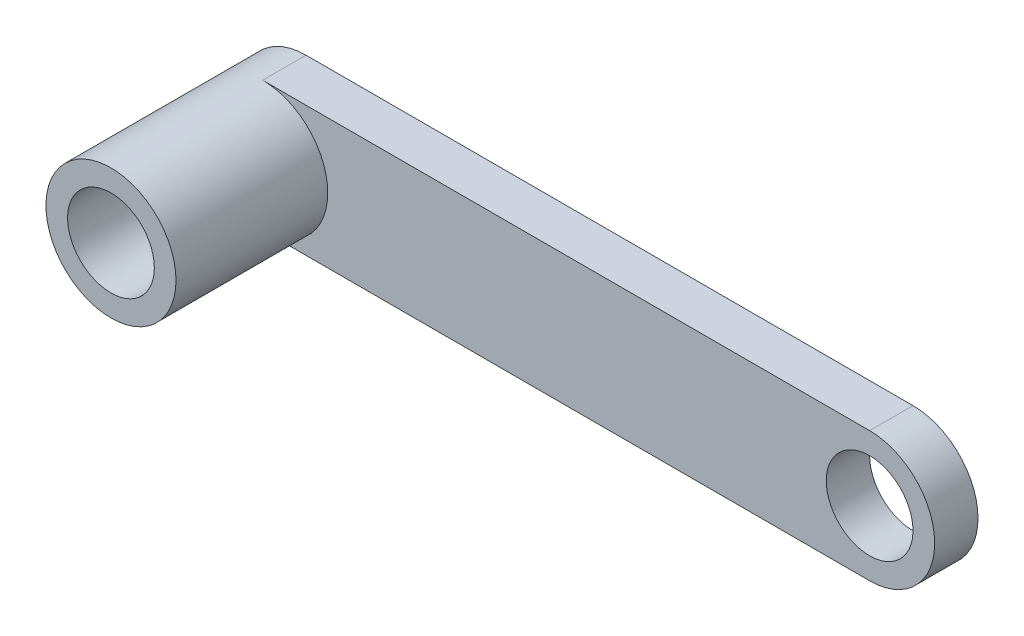
ISO-10303-21;
HEADER;
FILE_DESCRIPTION(('STEP AP214'),'2;1');
FILE_NAME('part.step','',(''),(''),'','','');
FILE_SCHEMA(('AUTOMOTIVE_DESIGN { 1 0 10303 214 1 1 1 1 }'));
ENDSEC;
DATA;
#1=APPLICATION_CONTEXT('core data for automotive mechanical design processes');
#2=APPLICATION_PROTOCOL_DEFINITION('international standard','automotive_design',2000,#1);
#3=PRODUCT_CONTEXT('',#1,'mechanical');
#4=PRODUCT('Part','Part','',(#3));
#5=PRODUCT_RELATED_PRODUCT_CATEGORY('part','',(#4));
#6=PRODUCT_DEFINITION_FORMATION('','',#4);
#7=PRODUCT_DEFINITION_CONTEXT('part definition',#1,'design');
#8=PRODUCT_DEFINITION('design','',#6,#7);
#9=PRODUCT_DEFINITION_SHAPE('','',#8);
#10=(LENGTH_UNIT() NAMED_UNIT(*) SI_UNIT(.MILLI.,.METRE.));
#11=(NAMED_UNIT(*) PLANE_ANGLE_UNIT() SI_UNIT($,.RADIAN.));
#12=(NAMED_UNIT(*) SI_UNIT($,.STERADIAN.) SOLID_ANGLE_UNIT());
#13=UNCERTAINTY_MEASURE_WITH_UNIT(LENGTH_MEASURE(1.E-05),#10,'distance_accuracy_value','');
#14=(GEOMETRIC_REPRESENTATION_CONTEXT(3) GLOBAL_UNCERTAINTY_ASSIGNED_CONTEXT((#13)) GLOBAL_UNIT_ASSIGNED_CONTEXT((#10,
#11,#12)) REPRESENTATION_CONTEXT('',''));
#15=CARTESIAN_POINT('',(0.,0.,0.));
#16=DIRECTION('',(0.,0.,1.));
#17=DIRECTION('',(1.,0.,0.));
#18=AXIS2_PLACEMENT_3D('',#15,#16,#17);
#19=CARTESIAN_POINT('',(-49.2925132380591,7.49999999999997,10.));
#20=DIRECTION('',(0.,0.,1.));
#21=DIRECTION('',(1.,0.,0.));
#22=AXIS2_PLACEMENT_3D('',#19,#20,#21);
#23=PLANE('',#22);
#24=CARTESIAN_POINT('',(-49.2925132380591,7.49999999999997,10.));
#25=DIRECTION('',(0.,0.,1.));
#26=DIRECTION('',(1.,0.,0.));
#27=AXIS2_PLACEMENT_3D('',#24,#25,#26);
#28=CIRCLE('',#27,15.);
#29=CARTESIAN_POINT('',(-49.2925132380591,-7.50000000000003,10.));
#30=VERTEX_POINT('',#29);
#31=CARTESIAN_POINT('',(-49.2925132380591,22.5,10.));
#32=VERTEX_POINT('',#31);
#33=EDGE_CURVE('E11',#30,#32,#28,.T.);
#34=ORIENTED_EDGE('',*,*,#33,.F.);
#35=DIRECTION('',(1.,0.,0.));
#36=VECTOR('',#35,1.);
#37=CARTESIAN_POINT('',(-49.2925132380591,-7.50000000000003,10.));
#38=LINE('',#37,#36);
#39=CARTESIAN_POINT('',(90.7074867619409,-7.50000000000001,10.));
#40=VERTEX_POINT('',#39);
#41=EDGE_CURVE('E115',#30,#40,#38,.T.);
#42=ORIENTED_EDGE('',*,*,#41,.T.);
#43=CARTESIAN_POINT('',(90.7074867619409,7.49999999999999,10.));
#44=DIRECTION('',(0.,0.,1.));
#45=DIRECTION('',(-1.,0.,0.));
#46=AXIS2_PLACEMENT_3D('',#43,#44,#45);
#47=CIRCLE('',#46,15.);
#48=CARTESIAN_POINT('',(90.7074867619409,22.5,10.));
#49=VERTEX_POINT('',#48);
#50=EDGE_CURVE('E60',#40,#49,#47,.T.);
#51=ORIENTED_EDGE('',*,*,#50,.T.);
#52=DIRECTION('',(-1.,0.,0.));
#53=VECTOR('',#52,1.);
#54=CARTESIAN_POINT('',(-49.2925132380591,22.5,10.));
#55=LINE('',#54,#53);
#56=EDGE_CURVE('E91',#49,#32,#55,.T.);
#57=ORIENTED_EDGE('',*,*,#56,.T.);
#58=EDGE_LOOP('',(#34,#42,#51,#57));
#59=FACE_BOUND('',#58,.T.);
#60=CARTESIAN_POINT('',(90.7074867619409,7.49999999999999,10.));
#61=DIRECTION('',(0.,0.,1.));
#62=DIRECTION('',(-1.,0.,0.));
#63=AXIS2_PLACEMENT_3D('',#60,#61,#62);
#64=CIRCLE('',#63,9.99999999999999);
#65=CARTESIAN_POINT('',(80.7074867619409,7.49999999999999,10.));
#66=VERTEX_POINT('',#65);
#67=EDGE_CURVE('E131',#66,#66,#64,.T.);
#68=ORIENTED_EDGE('',*,*,#67,.F.);
#69=EDGE_LOOP('',(#68));
#70=FACE_BOUND('',#69,.T.);
#71=ADVANCED_FACE('F41',(#59,#70),#23,.T.);
#72=CARTESIAN_POINT('',(-49.2925132380591,7.49999999999997,0.));
#73=DIRECTION('',(0.,0.,1.));
#74=DIRECTION('',(1.,0.,0.));
#75=AXIS2_PLACEMENT_3D('',#72,#73,#74);
#76=PLANE('',#75);
#77=CARTESIAN_POINT('',(-49.2925132380591,7.49999999999997,0.));
#78=DIRECTION('',(0.,0.,1.));
#79=DIRECTION('',(1.,0.,0.));
#80=AXIS2_PLACEMENT_3D('',#77,#78,#79);
#81=CIRCLE('',#80,15.);
#82=CARTESIAN_POINT('',(-49.2925132380591,22.5,0.));
#83=VERTEX_POINT('',#82);
#84=CARTESIAN_POINT('',(-49.2925132380591,-7.50000000000003,0.));
#85=VERTEX_POINT('',#84);
#86=EDGE_CURVE('E104',#83,#85,#81,.T.);
#87=ORIENTED_EDGE('',*,*,#86,.F.);
#88=DIRECTION('',(-1.,0.,0.));
#89=VECTOR('',#88,1.);
#90=CARTESIAN_POINT('',(-49.2925132380591,22.5,0.));
#91=LINE('',#90,#89);
#92=CARTESIAN_POINT('',(90.7074867619409,22.5,0.));
#93=VERTEX_POINT('',#92);
#94=EDGE_CURVE('E83',#93,#83,#91,.T.);
#95=ORIENTED_EDGE('',*,*,#94,.F.);
#96=CARTESIAN_POINT('',(90.7074867619409,7.49999999999999,0.));
#97=DIRECTION('',(0.,0.,1.));
#98=DIRECTION('',(-1.,0.,0.));
#99=AXIS2_PLACEMENT_3D('',#96,#97,#98);
#100=CIRCLE('',#99,15.);
#101=CARTESIAN_POINT('',(90.7074867619409,-7.50000000000001,0.));
#102=VERTEX_POINT('',#101);
#103=EDGE_CURVE('E77',#102,#93,#100,.T.);
#104=ORIENTED_EDGE('',*,*,#103,.F.);
#105=DIRECTION('',(1.,0.,0.));
#106=VECTOR('',#105,1.);
#107=CARTESIAN_POINT('',(-49.2925132380591,-7.50000000000003,0.));
#108=LINE('',#107,#106);
#109=EDGE_CURVE('E118',#85,#102,#108,.T.);
#110=ORIENTED_EDGE('',*,*,#109,.F.);
#111=EDGE_LOOP('',(#87,#95,#104,#110));
#112=FACE_BOUND('',#111,.T.);
#113=CARTESIAN_POINT('',(-49.2925132380591,7.49999999999997,0.));
#114=DIRECTION('',(0.,0.,1.));
#115=DIRECTION('',(1.,0.,0.));
#116=AXIS2_PLACEMENT_3D('',#113,#114,#115);
#117=CIRCLE('',#116,10.);
#118=CARTESIAN_POINT('',(-39.2925132380591,7.49999999999997,0.));
#119=VERTEX_POINT('',#118);
#120=EDGE_CURVE('E122',#119,#119,#117,.T.);
#121=ORIENTED_EDGE('',*,*,#120,.T.);
#122=EDGE_LOOP('',(#121));
#123=FACE_BOUND('',#122,.T.);
#124=CARTESIAN_POINT('',(90.7074867619409,7.49999999999999,0.));
#125=DIRECTION('',(0.,0.,1.));
#126=DIRECTION('',(-1.,0.,0.));
#127=AXIS2_PLACEMENT_3D('',#124,#125,#126);
#128=CIRCLE('',#127,9.99999999999999);
#129=CARTESIAN_POINT('',(80.7074867619409,7.49999999999999,0.));
#130=VERTEX_POINT('',#129);
#131=EDGE_CURVE('E132',#130,#130,#128,.T.);
#132=ORIENTED_EDGE('',*,*,#131,.T.);
#133=EDGE_LOOP('',(#132));
#134=FACE_BOUND('',#133,.T.);
#135=ADVANCED_FACE('F161',(#112,#123,#134),#76,.F.);
#136=CARTESIAN_POINT('',(-49.2925132380591,7.49999999999997,10.));
#137=DIRECTION('',(0.,0.,-1.));
#138=DIRECTION('',(-1.,0.,0.));
#139=AXIS2_PLACEMENT_3D('',#136,#137,#138);
#140=CYLINDRICAL_SURFACE('',#139,15.);
#141=ORIENTED_EDGE('',*,*,#86,.T.);
#142=DIRECTION('',(0.,0.,-1.));
#143=VECTOR('',#142,1.);
#144=CARTESIAN_POINT('',(-49.2925132380591,-7.50000000000003,10.));
#145=LINE('',#144,#143);
#146=EDGE_CURVE('E45',#30,#85,#145,.T.);
#147=ORIENTED_EDGE('',*,*,#146,.F.);
#148=ORIENTED_EDGE('',*,*,#33,.T.);
#149=DIRECTION('',(0.,0.,-1.));
#150=VECTOR('',#149,1.);
#151=CARTESIAN_POINT('',(-49.2925132380591,22.5,10.));
#152=LINE('',#151,#150);
#153=EDGE_CURVE('E89',#32,#83,#152,.T.);
#154=ORIENTED_EDGE('',*,*,#153,.T.);
#155=EDGE_LOOP('',(#141,#147,#148,#154));
#156=FACE_BOUND('',#155,.T.);
#157=CARTESIAN_POINT('',(-49.2925132380591,7.49999999999997,45.));
#158=DIRECTION('',(0.,0.,1.));
#159=DIRECTION('',(1.,0.,0.));
#160=AXIS2_PLACEMENT_3D('',#157,#158,#159);
#161=CIRCLE('',#160,15.);
#162=CARTESIAN_POINT('',(-34.2925132380591,7.49999999999997,45.));
#163=VERTEX_POINT('',#162);
#164=EDGE_CURVE('E136',#163,#163,#161,.T.);
#165=ORIENTED_EDGE('',*,*,#164,.F.);
#166=EDGE_LOOP('',(#165));
#167=FACE_BOUND('',#166,.T.);
#168=ADVANCED_FACE('F43',(#156,#167),#140,.T.);
#169=CARTESIAN_POINT('',(-49.2925132380591,-7.50000000000003,10.));
#170=DIRECTION('',(0.,1.,0.));
#171=DIRECTION('',(-1.,0.,0.));
#172=AXIS2_PLACEMENT_3D('',#169,#170,#171);
#173=PLANE('',#172);
#174=ORIENTED_EDGE('',*,*,#109,.T.);
#175=DIRECTION('',(0.,0.,-1.));
#176=VECTOR('',#175,1.);
#177=CARTESIAN_POINT('',(90.7074867619409,-7.50000000000001,10.));
#178=LINE('',#177,#176);
#179=EDGE_CURVE('E107',#40,#102,#178,.T.);
#180=ORIENTED_EDGE('',*,*,#179,.F.);
#181=ORIENTED_EDGE('',*,*,#41,.F.);
#182=ORIENTED_EDGE('',*,*,#146,.T.);
#183=EDGE_LOOP('',(#174,#180,#181,#182));
#184=FACE_BOUND('',#183,.T.);
#185=ADVANCED_FACE('F174',(#184),#173,.F.);
#186=CARTESIAN_POINT('',(90.7074867619409,7.49999999999999,10.));
#187=DIRECTION('',(0.,0.,-1.));
#188=DIRECTION('',(-1.,0.,0.));
#189=AXIS2_PLACEMENT_3D('',#186,#187,#188);
#190=CYLINDRICAL_SURFACE('',#189,15.);
#191=ORIENTED_EDGE('',*,*,#103,.T.);
#192=DIRECTION('',(0.,0.,-1.));
#193=VECTOR('',#192,1.);
#194=CARTESIAN_POINT('',(90.7074867619409,22.5,10.));
#195=LINE('',#194,#193);
#196=EDGE_CURVE('E96',#49,#93,#195,.T.);
#197=ORIENTED_EDGE('',*,*,#196,.F.);
#198=ORIENTED_EDGE('',*,*,#50,.F.);
#199=ORIENTED_EDGE('',*,*,#179,.T.);
#200=EDGE_LOOP('',(#191,#197,#198,#199));
#201=FACE_BOUND('',#200,.T.);
#202=ADVANCED_FACE('F172',(#201),#190,.T.);
#203=CARTESIAN_POINT('',(-49.2925132380591,22.5,10.));
#204=DIRECTION('',(0.,-1.,0.));
#205=DIRECTION('',(1.,0.,0.));
#206=AXIS2_PLACEMENT_3D('',#203,#204,#205);
#207=PLANE('',#206);
#208=ORIENTED_EDGE('',*,*,#94,.T.);
#209=ORIENTED_EDGE('',*,*,#153,.F.);
#210=ORIENTED_EDGE('',*,*,#56,.F.);
#211=ORIENTED_EDGE('',*,*,#196,.T.);
#212=EDGE_LOOP('',(#208,#209,#210,#211));
#213=FACE_BOUND('',#212,.T.);
#214=ADVANCED_FACE('F90',(#213),#207,.F.);
#215=CARTESIAN_POINT('',(-49.2925132380591,7.49999999999997,10.));
#216=DIRECTION('',(0.,0.,-1.));
#217=DIRECTION('',(-1.,0.,0.));
#218=AXIS2_PLACEMENT_3D('',#215,#216,#217);
#219=CYLINDRICAL_SURFACE('',#218,10.);
#220=ORIENTED_EDGE('',*,*,#120,.F.);
#221=EDGE_LOOP('',(#220));
#222=FACE_BOUND('',#221,.T.);
#223=CARTESIAN_POINT('',(-49.2925132380591,7.49999999999997,45.));
#224=DIRECTION('',(0.,0.,1.));
#225=DIRECTION('',(1.,0.,0.));
#226=AXIS2_PLACEMENT_3D('',#223,#224,#225);
#227=CIRCLE('',#226,10.);
#228=CARTESIAN_POINT('',(-39.2925132380591,7.49999999999997,45.));
#229=VERTEX_POINT('',#228);
#230=EDGE_CURVE('E143',#229,#229,#227,.T.);
#231=ORIENTED_EDGE('',*,*,#230,.T.);
#232=EDGE_LOOP('',(#231));
#233=FACE_BOUND('',#232,.T.);
#234=ADVANCED_FACE('F148',(#222,#233),#219,.F.);
#235=CARTESIAN_POINT('',(90.7074867619409,7.49999999999999,10.));
#236=DIRECTION('',(0.,0.,-1.));
#237=DIRECTION('',(-1.,0.,0.));
#238=AXIS2_PLACEMENT_3D('',#235,#236,#237);
#239=CYLINDRICAL_SURFACE('',#238,9.99999999999999);
#240=ORIENTED_EDGE('',*,*,#67,.T.);
#241=EDGE_LOOP('',(#240));
#242=FACE_BOUND('',#241,.T.);
#243=ORIENTED_EDGE('',*,*,#131,.F.);
#244=EDGE_LOOP('',(#243));
#245=FACE_BOUND('',#244,.T.);
#246=ADVANCED_FACE('F152',(#242,#245),#239,.F.);
#247=CARTESIAN_POINT('',(-49.2925132380591,7.49999999999997,45.));
#248=DIRECTION('',(0.,0.,1.));
#249=DIRECTION('',(1.,0.,0.));
#250=AXIS2_PLACEMENT_3D('',#247,#248,#249);
#251=PLANE('',#250);
#252=ORIENTED_EDGE('',*,*,#164,.T.);
#253=EDGE_LOOP('',(#252));
#254=FACE_BOUND('',#253,.T.);
#255=ORIENTED_EDGE('',*,*,#230,.F.);
#256=EDGE_LOOP('',(#255));
#257=FACE_BOUND('',#256,.T.);
#258=ADVANCED_FACE('F150',(#254,#257),#251,.T.);
#259=CLOSED_SHELL('',(#71,#135,#168,#185,#202,#214,#234,#246,#258));
#260=MANIFOLD_SOLID_BREP('B2',#259);
#261=ADVANCED_BREP_SHAPE_REPRESENTATION('',(#18,#260),#14);
#262=SHAPE_DEFINITION_REPRESENTATION(#9,#261);
ENDSEC;
END-ISO-10303-21;
